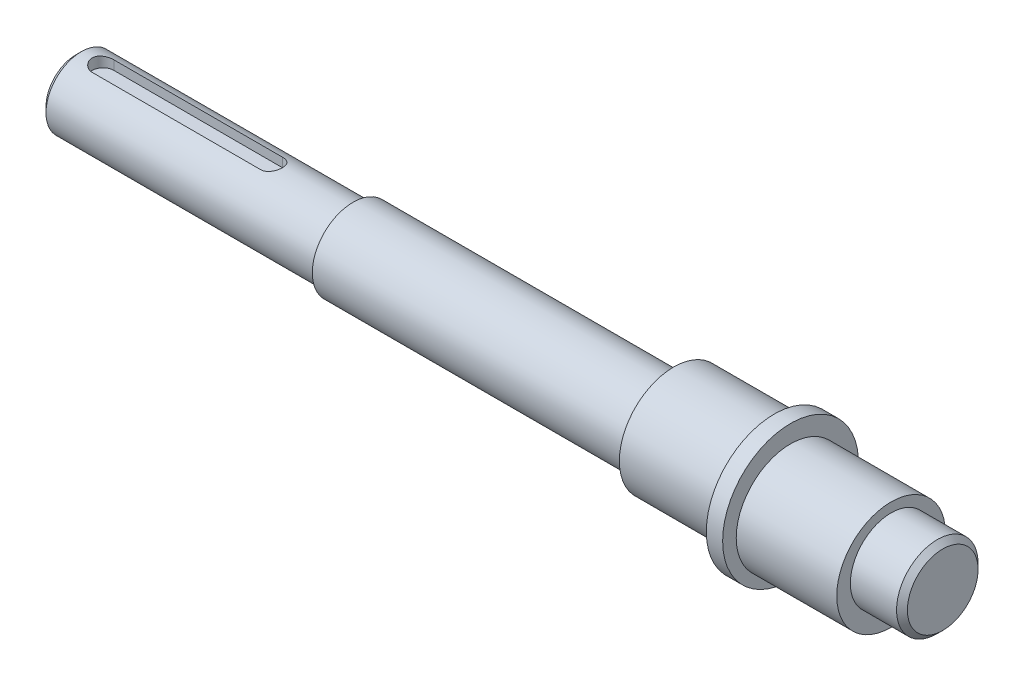
ISO-10303-21;
HEADER;
FILE_DESCRIPTION(('STEP AP214'),'2;1');
FILE_NAME('part.step','',(''),(''),'','','');
FILE_SCHEMA(('AUTOMOTIVE_DESIGN { 1 0 10303 214 1 1 1 1 }'));
ENDSEC;
DATA;
#1=APPLICATION_CONTEXT('core data for automotive mechanical design processes');
#2=APPLICATION_PROTOCOL_DEFINITION('international standard','automotive_design',2000,#1);
#3=PRODUCT_CONTEXT('',#1,'mechanical');
#4=PRODUCT('Part','Part','',(#3));
#5=PRODUCT_RELATED_PRODUCT_CATEGORY('part','',(#4));
#6=PRODUCT_DEFINITION_FORMATION('','',#4);
#7=PRODUCT_DEFINITION_CONTEXT('part definition',#1,'design');
#8=PRODUCT_DEFINITION('design','',#6,#7);
#9=PRODUCT_DEFINITION_SHAPE('','',#8);
#10=(LENGTH_UNIT() NAMED_UNIT(*) SI_UNIT(.MILLI.,.METRE.));
#11=(NAMED_UNIT(*) PLANE_ANGLE_UNIT() SI_UNIT($,.RADIAN.));
#12=(NAMED_UNIT(*) SI_UNIT($,.STERADIAN.) SOLID_ANGLE_UNIT());
#13=UNCERTAINTY_MEASURE_WITH_UNIT(LENGTH_MEASURE(1.E-05),#10,'distance_accuracy_value','');
#14=(GEOMETRIC_REPRESENTATION_CONTEXT(3) GLOBAL_UNCERTAINTY_ASSIGNED_CONTEXT((#13)) GLOBAL_UNIT_ASSIGNED_CONTEXT((#10,
#11,#12)) REPRESENTATION_CONTEXT('',''));
#15=CARTESIAN_POINT('',(0.,0.,0.));
#16=DIRECTION('',(0.,0.,1.));
#17=DIRECTION('',(1.,0.,0.));
#18=AXIS2_PLACEMENT_3D('',#15,#16,#17);
#19=CARTESIAN_POINT('',(0.,0.,0.));
#20=DIRECTION('',(-1.,0.,0.));
#21=DIRECTION('',(0.,0.,1.));
#22=AXIS2_PLACEMENT_3D('',#19,#20,#21);
#23=CYLINDRICAL_SURFACE('',#22,13.);
#24=CARTESIAN_POINT('',(102.,0.,0.));
#25=DIRECTION('',(-1.,0.,0.));
#26=DIRECTION('',(0.,0.,1.));
#27=AXIS2_PLACEMENT_3D('',#24,#25,#26);
#28=CIRCLE('',#27,13.);
#29=CARTESIAN_POINT('',(102.,0.,13.));
#30=VERTEX_POINT('',#29);
#31=EDGE_CURVE('E176',#30,#30,#28,.T.);
#32=ORIENTED_EDGE('',*,*,#31,.T.);
#33=EDGE_LOOP('',(#32));
#34=FACE_BOUND('',#33,.T.);
#35=DIRECTION('',(-1.,0.,0.));
#36=VECTOR('',#35,1.);
#37=CARTESIAN_POINT('',(0.,12.369316876853,-4.));
#38=LINE('',#37,#36);
#39=CARTESIAN_POINT('',(10.,12.369316876853,-4.));
#40=VERTEX_POINT('',#39);
#41=CARTESIAN_POINT('',(72.,12.369316876853,-4.));
#42=VERTEX_POINT('',#41);
#43=EDGE_CURVE('E70',#40,#42,#38,.F.);
#44=ORIENTED_EDGE('',*,*,#43,.T.);
#45=CARTESIAN_POINT('',(72.,12.369316876853,-4.));
#46=CARTESIAN_POINT('',(72.1096372600446,12.3693011060559,-4.00001385554605));
#47=CARTESIAN_POINT('',(72.2192655313805,12.3707741918502,-3.99549264927955));
#48=CARTESIAN_POINT('',(72.437682370079,12.3765808295348,-3.97748793948736));
#49=CARTESIAN_POINT('',(72.5464711284459,12.3809137101209,-3.96400653926006));
#50=CARTESIAN_POINT('',(72.7621561511989,12.3923078282768,-3.9282361528359));
#51=CARTESIAN_POINT('',(72.8690566313853,12.399361878995,-3.90597036349974));
#52=CARTESIAN_POINT('',(73.0804758893724,12.4159696129904,-3.85285190224663));
#53=CARTESIAN_POINT('',(73.1849945996163,12.4255233670738,-3.82199898709018));
#54=CARTESIAN_POINT('',(73.4938136119439,12.4575175837827,-3.71694513232446));
#55=CARTESIAN_POINT('',(73.6936609638533,12.483307156321,-3.63020142616738));
#56=CARTESIAN_POINT('',(74.0759730566924,12.5408839490093,-3.42599155981652));
#57=CARTESIAN_POINT('',(74.2584290710015,12.572674156561,-3.30851008560228));
#58=CARTESIAN_POINT('',(74.6068944704852,12.639849464286,-3.04197546692094));
#59=CARTESIAN_POINT('',(74.7722464055913,12.6753137902419,-2.892081048213));
#60=CARTESIAN_POINT('',(75.0759050606162,12.7451676286833,-2.56677638136855));
#61=CARTESIAN_POINT('',(75.214207160722,12.7795569567298,-2.391361783573));
#62=CARTESIAN_POINT('',(75.4627491497664,12.8442939900254,-2.01525564040856));
#63=CARTESIAN_POINT('',(75.5723094463478,12.8745369018167,-1.81409533176948));
#64=CARTESIAN_POINT('',(75.7557811144326,12.9266435229377,-1.39512400470614));
#65=CARTESIAN_POINT('',(75.8297020523437,12.9485094805068,-1.17731747270964));
#66=CARTESIAN_POINT('',(75.9376008367771,12.980836680659,-0.738159816541966));
#67=CARTESIAN_POINT('',(75.9727098340494,12.9916202110484,-0.517110769217928));
#68=CARTESIAN_POINT('',(76.0055692569542,13.0017046486491,-0.0720095541966275));
#69=CARTESIAN_POINT('',(76.0033271593172,13.0010078539271,0.152042003503076));
#70=CARTESIAN_POINT('',(75.9622968189137,12.9884354452262,0.588828322821336));
#71=CARTESIAN_POINT('',(75.9247349307784,12.976934963743,0.801690801267577));
#72=CARTESIAN_POINT('',(75.8161398522449,12.9445067865243,1.21792737916861));
#73=CARTESIAN_POINT('',(75.7451048789415,12.923578588635,1.42130097257467));
#74=CARTESIAN_POINT('',(75.5707776354454,12.8741371346781,1.81565284792357));
#75=CARTESIAN_POINT('',(75.467107683292,12.8455356806846,2.00645263453306));
#76=CARTESIAN_POINT('',(75.2307457129234,12.7837686435913,2.36833420473324));
#77=CARTESIAN_POINT('',(75.0980468640906,12.7506019869631,2.53941133301027));
#78=CARTESIAN_POINT('',(74.8011250886356,12.6816648743268,2.86427703670677));
#79=CARTESIAN_POINT('',(74.6358457956793,12.6458433558745,3.0170888572714));
#80=CARTESIAN_POINT('',(74.2815126504035,12.5767737605626,3.29318735472968));
#81=CARTESIAN_POINT('',(74.0924517537655,12.5435264509396,3.41646525186121));
#82=CARTESIAN_POINT('',(73.7938396017376,12.4983185398609,3.57703281324441));
#83=CARTESIAN_POINT('',(73.6911363005608,12.48395455757,3.62672040705996));
#84=CARTESIAN_POINT('',(73.4816454525383,12.4573073197885,3.7172196774293));
#85=CARTESIAN_POINT('',(73.3748596042099,12.4450232102831,3.75803499898249));
#86=CARTESIAN_POINT('',(73.1580745856221,12.4229432446499,3.83039332264369));
#87=CARTESIAN_POINT('',(73.0480789565303,12.413144753996,3.86194614776658));
#88=CARTESIAN_POINT('',(72.8256286652894,12.3963449677289,3.91553543389294));
#89=CARTESIAN_POINT('',(72.71317515978,12.3893423850732,3.93757627393456));
#90=CARTESIAN_POINT('',(72.5006880875263,12.3790500430556,3.96980876445186));
#91=CARTESIAN_POINT('',(72.4008413202086,12.3754078485105,3.98112989977237));
#92=CARTESIAN_POINT('',(72.2006656348951,12.3705374921442,3.9962248840057));
#93=CARTESIAN_POINT('',(72.1003376173718,12.3693058643752,4.00000956907256));
#94=CARTESIAN_POINT('',(72.,12.369316876853,4.));
#95=B_SPLINE_CURVE_WITH_KNOTS('',3,(#45,#46,#47,#48,#49,#50,#51,#52,#53,#54,#55,#56,#57,#58,#59,
#60,#61,#62,#63,#64,#65,#66,#67,#68,#69,#70,#71,#72,#73,#74,#75,#76,#77,#78,#79,#80,#81,#82,#83,
#84,#85,#86,#87,#88,#89,#90,#91,#92,#93,#94),.UNSPECIFIED.,.F.,.F.,(4,2,2,2,2,2,2,2,2,2,2,2,2,2,
2,2,2,2,2,2,2,2,2,2,4),(0.,0.328793421203149,0.65750968932791,0.985363667706867,
1.31322693384514,1.96809857989085,2.6232971162299,3.2981478003895,3.97311364113685,
4.66283549043959,5.35237209962388,6.02123451698755,6.68996304687303,7.33629750679724,
7.98266639687212,8.63680913532383,9.2911059621096,9.97181686260362,10.6527298725226,
10.9973477032526,11.3418236857872,11.6859330155993,12.0298837581651,12.3312338730857,
12.6321503832144),.UNSPECIFIED.);
#96=CARTESIAN_POINT('',(72.,12.369316876853,4.));
#97=VERTEX_POINT('',#96);
#98=EDGE_CURVE('E113',#42,#97,#95,.T.);
#99=ORIENTED_EDGE('',*,*,#98,.T.);
#100=DIRECTION('',(-1.,0.,0.));
#101=VECTOR('',#100,1.);
#102=CARTESIAN_POINT('',(0.,12.369316876853,4.));
#103=LINE('',#102,#101);
#104=CARTESIAN_POINT('',(10.,12.369316876853,4.));
#105=VERTEX_POINT('',#104);
#106=EDGE_CURVE('E127',#97,#105,#103,.T.);
#107=ORIENTED_EDGE('',*,*,#106,.T.);
#108=CARTESIAN_POINT('',(10.,12.369316876853,4.));
#109=CARTESIAN_POINT('',(9.89036273995537,12.3693011060559,4.00001385554605));
#110=CARTESIAN_POINT('',(9.78073446861947,12.3707741918502,3.99549264927955));
#111=CARTESIAN_POINT('',(9.56231762992102,12.3765808295348,3.97748793948736));
#112=CARTESIAN_POINT('',(9.45352887155407,12.3809137101209,3.96400653926006));
#113=CARTESIAN_POINT('',(9.23784384880108,12.3923078282768,3.9282361528359));
#114=CARTESIAN_POINT('',(9.13094336861471,12.399361878995,3.90597036349973));
#115=CARTESIAN_POINT('',(8.91952411062753,12.4159696129904,3.85285190224662));
#116=CARTESIAN_POINT('',(8.81500540038364,12.4255233670738,3.82199898709017));
#117=CARTESIAN_POINT('',(8.50618638805607,12.4575175837827,3.71694513232446));
#118=CARTESIAN_POINT('',(8.30633903614675,12.483307156321,3.63020142616738));
#119=CARTESIAN_POINT('',(7.92402694330763,12.5408839490093,3.42599155981652));
#120=CARTESIAN_POINT('',(7.74157092899853,12.572674156561,3.30851008560228));
#121=CARTESIAN_POINT('',(7.39310552951482,12.639849464286,3.04197546692094));
#122=CARTESIAN_POINT('',(7.22775359440872,12.6753137902419,2.89208104821299));
#123=CARTESIAN_POINT('',(6.92409493938383,12.7451676286833,2.56677638136855));
#124=CARTESIAN_POINT('',(6.78579283927796,12.7795569567298,2.39136178357301));
#125=CARTESIAN_POINT('',(6.5372508502336,12.8442939900254,2.01525564040857));
#126=CARTESIAN_POINT('',(6.42769055365221,12.8745369018167,1.81409533176949));
#127=CARTESIAN_POINT('',(6.24421888556742,12.9266435229377,1.39512400470615));
#128=CARTESIAN_POINT('',(6.17029794765629,12.9485094805067,1.17731747270964));
#129=CARTESIAN_POINT('',(6.06239916322291,12.9808366806589,0.738159816541973));
#130=CARTESIAN_POINT('',(6.02729016595059,12.9916202110484,0.517110769217936));
#131=CARTESIAN_POINT('',(5.99443074304575,13.0017046486491,0.0720095541966365));
#132=CARTESIAN_POINT('',(5.99667284068277,13.0010078539271,-0.152042003503067));
#133=CARTESIAN_POINT('',(6.0377031810863,12.9884354452262,-0.588828322821328));
#134=CARTESIAN_POINT('',(6.07526506922162,12.976934963743,-0.801690801267568));
#135=CARTESIAN_POINT('',(6.18386014775509,12.9445067865243,-1.2179273791686));
#136=CARTESIAN_POINT('',(6.25489512105847,12.923578588635,-1.42130097257467));
#137=CARTESIAN_POINT('',(6.42922236455455,12.8741371346781,-1.81565284792357));
#138=CARTESIAN_POINT('',(6.532892316708,12.8455356806846,-2.00645263453305));
#139=CARTESIAN_POINT('',(6.76925428707662,12.7837686435913,-2.36833420473324));
#140=CARTESIAN_POINT('',(6.90195313590943,12.7506019869631,-2.53941133301026));
#141=CARTESIAN_POINT('',(7.19887491136439,12.6816648743268,-2.86427703670677));
#142=CARTESIAN_POINT('',(7.36415420432072,12.6458433558745,-3.0170888572714));
#143=CARTESIAN_POINT('',(7.71848734959652,12.5767737605626,-3.29318735472968));
#144=CARTESIAN_POINT('',(7.90754824623452,12.5435264509396,-3.41646525186121));
#145=CARTESIAN_POINT('',(8.20616039826237,12.4983185398609,-3.57703281324441));
#146=CARTESIAN_POINT('',(8.30886369943916,12.48395455757,-3.62672040705995));
#147=CARTESIAN_POINT('',(8.51835454746166,12.4573073197885,-3.7172196774293));
#148=CARTESIAN_POINT('',(8.62514039579012,12.4450232102831,-3.75803499898249));
#149=CARTESIAN_POINT('',(8.84192541437791,12.4229432446499,-3.83039332264369));
#150=CARTESIAN_POINT('',(8.95192104346967,12.413144753996,-3.86194614776658));
#151=CARTESIAN_POINT('',(9.17437133471058,12.3963449677289,-3.91553543389294));
#152=CARTESIAN_POINT('',(9.28682484021998,12.3893423850733,-3.93757627393455));
#153=CARTESIAN_POINT('',(9.4993119124737,12.3790500430556,-3.96980876445186));
#154=CARTESIAN_POINT('',(9.59915867979138,12.3754078485105,-3.98112989977237));
#155=CARTESIAN_POINT('',(9.7993343651049,12.3705374921442,-3.9962248840057));
#156=CARTESIAN_POINT('',(9.89966238262821,12.3693058643752,-4.00000956907256));
#157=CARTESIAN_POINT('',(10.,12.369316876853,-4.));
#158=B_SPLINE_CURVE_WITH_KNOTS('',3,(#108,#109,#110,#111,#112,#113,#114,#115,#116,#117,#118,
#119,#120,#121,#122,#123,#124,#125,#126,#127,#128,#129,#130,#131,#132,#133,#134,#135,#136,#137,
#138,#139,#140,#141,#142,#143,#144,#145,#146,#147,#148,#149,#150,#151,#152,#153,#154,#155,#156,
#157),.UNSPECIFIED.,.F.,.F.,(4,2,2,2,2,2,2,2,2,2,2,2,2,2,2,2,2,2,2,2,2,2,2,2,4),(0.,
0.328793421203159,0.657509689327917,0.985363667706894,1.31322693384514,1.96809857989084,
2.62329711622991,3.2981478003895,3.97311364113684,4.66283549043959,5.35237209962388,
6.02123451698754,6.68996304687302,7.33629750679723,7.98266639687211,8.63680913532382,
9.29110596210959,9.97181686260362,10.6527298725226,10.9973477032526,11.3418236857872,
11.6859330155993,12.0298837581651,12.3312338730857,12.6321503832144),.UNSPECIFIED.);
#159=EDGE_CURVE('E62',#105,#40,#158,.T.);
#160=ORIENTED_EDGE('',*,*,#159,.T.);
#161=EDGE_LOOP('',(#44,#99,#107,#160));
#162=FACE_BOUND('',#161,.T.);
#163=CARTESIAN_POINT('',(2.00000000000001,0.,0.));
#164=DIRECTION('',(1.,0.,0.));
#165=DIRECTION('',(0.,0.,-1.));
#166=AXIS2_PLACEMENT_3D('',#163,#164,#165);
#167=CIRCLE('',#166,13.);
#168=CARTESIAN_POINT('',(2.00000000000001,0.,-13.));
#169=VERTEX_POINT('',#168);
#170=EDGE_CURVE('E225',#169,#169,#167,.T.);
#171=ORIENTED_EDGE('',*,*,#170,.T.);
#172=EDGE_LOOP('',(#171));
#173=FACE_BOUND('',#172,.T.);
#174=CARTESIAN_POINT('',(66.9173344945528,-12.6835606052715,-2.85084029233573));
#175=CARTESIAN_POINT('',(67.1157213952259,-12.6552913916044,-2.97662670948751));
#176=CARTESIAN_POINT('',(67.3253783806156,-12.6288982722451,-3.08539767422088));
#177=CARTESIAN_POINT('',(67.7605506543675,-12.5830707684621,-3.26728815263414));
#178=CARTESIAN_POINT('',(67.9860909164697,-12.5636476492071,-3.34035002033104));
#179=CARTESIAN_POINT('',(68.4473360877684,-12.5340342309266,-3.44981672616192));
#180=CARTESIAN_POINT('',(68.6830737396497,-12.5238764075633,-3.48609267572668));
#181=CARTESIAN_POINT('',(69.1574274800679,-12.5141243818434,-3.52094068154293));
#182=CARTESIAN_POINT('',(69.3960424389025,-12.5145261603711,-3.51952708290181));
#183=CARTESIAN_POINT('',(69.875470947315,-12.5259726132645,-3.4785742083382));
#184=CARTESIAN_POINT('',(70.1162016859176,-12.5372703335671,-3.43812844017442));
#185=CARTESIAN_POINT('',(70.5872329687111,-12.5694848384384,-3.31841245117753));
#186=CARTESIAN_POINT('',(70.8175303296424,-12.590404537282,-3.2391304672791));
#187=CARTESIAN_POINT('',(71.2596318460295,-12.6391377942759,-3.04340041590033));
#188=CARTESIAN_POINT('',(71.4715226798384,-12.6669163734039,-2.92714008998995));
#189=CARTESIAN_POINT('',(71.8710065258989,-12.7259187862294,-2.65890704484376));
#190=CARTESIAN_POINT('',(72.0586000568432,-12.7571425463538,-2.50693508816587));
#191=CARTESIAN_POINT('',(72.3923080058158,-12.817133228402,-2.17884210006733));
#192=CARTESIAN_POINT('',(72.5401069155112,-12.845942125574,-2.00445237108882));
#193=CARTESIAN_POINT('',(72.799088523332,-12.8988271246437,-1.62967157831974));
#194=CARTESIAN_POINT('',(72.910320674079,-12.9229096005968,-1.42931614621692));
#195=CARTESIAN_POINT('',(73.0767055447635,-12.9598544110828,-1.03712245044674));
#196=CARTESIAN_POINT('',(73.1373677091013,-12.9737863832827,-0.847726891800303));
#197=CARTESIAN_POINT('',(73.221561148623,-12.993281173824,-0.460479090835774));
#198=CARTESIAN_POINT('',(73.2451322505388,-12.9988529686523,-0.262636153802116));
#199=CARTESIAN_POINT('',(73.2529692259831,-13.0007001256065,0.108165730053142));
#200=CARTESIAN_POINT('',(73.241919946633,-12.998083596739,0.281037107815758));
#201=CARTESIAN_POINT('',(73.191124610368,-12.9862208627676,0.622246768923069));
#202=CARTESIAN_POINT('',(73.1513809177182,-12.9769752038687,0.790585424554371));
#203=CARTESIAN_POINT('',(73.0462294406367,-12.9530750516817,1.11532635839424));
#204=CARTESIAN_POINT('',(72.9812749559734,-12.9385163509229,1.27188416817763));
#205=CARTESIAN_POINT('',(72.8285604864168,-12.9053800837984,1.57293869007208));
#206=CARTESIAN_POINT('',(72.7407942762888,-12.8868014206321,1.71743209560869));
#207=CARTESIAN_POINT('',(72.536470720653,-12.8453719185997,2.00485573146585));
#208=CARTESIAN_POINT('',(72.4179905131795,-12.8222841691974,2.14638083702675));
#209=CARTESIAN_POINT('',(72.161506283146,-12.7753102543076,2.41028019565786));
#210=CARTESIAN_POINT('',(72.0234922806739,-12.7514236854932,2.53264459169497));
#211=CARTESIAN_POINT('',(71.7116591892001,-12.7016375759763,2.77225163127206));
#212=CARTESIAN_POINT('',(71.5355240493874,-12.6759079184577,2.88651870781126));
#213=CARTESIAN_POINT('',(71.1676342061548,-12.6284862637664,3.08739417114627));
#214=CARTESIAN_POINT('',(70.9758722697889,-12.6067961517541,3.17398965769151));
#215=CARTESIAN_POINT('',(70.5604336753438,-12.5675469810236,3.32620428781362));
#216=CARTESIAN_POINT('',(70.3355238129305,-12.5506645940509,3.38864917036018));
#217=CARTESIAN_POINT('',(69.8782207138271,-12.5262897247362,3.47767168846793));
#218=CARTESIAN_POINT('',(69.6458259887777,-12.5187991219156,3.50424214477679));
#219=CARTESIAN_POINT('',(69.1702497399692,-12.5139770254183,3.52143369836946));
#220=CARTESIAN_POINT('',(68.9270087706744,-12.5170641494682,3.51057335867875));
#221=CARTESIAN_POINT('',(68.4458112568562,-12.5339566074032,3.44976851738166));
#222=CARTESIAN_POINT('',(68.2078554844298,-12.5477634968471,3.3998183433914));
#223=CARTESIAN_POINT('',(67.7432961698748,-12.5844500383419,3.26140096871732));
#224=CARTESIAN_POINT('',(67.5167311215536,-12.6073583933653,3.17281182638315));
#225=CARTESIAN_POINT('',(67.0826269225019,-12.6594023113411,2.95832212055732));
#226=CARTESIAN_POINT('',(66.8750915325462,-12.6885391014268,2.83241420258684));
#227=CARTESIAN_POINT('',(66.4920294286561,-12.7484074162907,2.54919999933605));
#228=CARTESIAN_POINT('',(66.3157600576138,-12.7790699890963,2.3928888885814));
#229=CARTESIAN_POINT('',(65.9959104122984,-12.8386227276397,2.04938756864715));
#230=CARTESIAN_POINT('',(65.8523030832367,-12.8675143457044,1.8622231393537));
#231=CARTESIAN_POINT('',(65.6192638171656,-12.9163875925768,1.48305272742568));
#232=CARTESIAN_POINT('',(65.5256914095051,-12.9369903950704,1.29368451890605));
#233=CARTESIAN_POINT('',(65.3772980464777,-12.9703241385579,0.899727056803342));
#234=CARTESIAN_POINT('',(65.3224203396953,-12.9830666044307,0.695160582843896));
#235=CARTESIAN_POINT('',(65.2603932546736,-12.9975371198872,0.30939318939838));
#236=CARTESIAN_POINT('',(65.2474259968566,-13.0006060996969,0.12916369584239));
#237=CARTESIAN_POINT('',(65.2534167269883,-12.999195621822,-0.230704261775413));
#238=CARTESIAN_POINT('',(65.2723627031422,-12.9947190042179,-0.41034292272312));
#239=CARTESIAN_POINT('',(65.3387109560351,-12.9793074493634,-0.75158371504155));
#240=CARTESIAN_POINT('',(65.3841563050901,-12.9688174150026,-0.913594430270775));
#241=CARTESIAN_POINT('',(65.4996216064334,-12.9428182083359,-1.22816637356345));
#242=CARTESIAN_POINT('',(65.5696494478963,-12.9273074248629,-1.38072454954225));
#243=CARTESIAN_POINT('',(65.7361100366328,-12.8916859827619,-1.68189800851314));
#244=CARTESIAN_POINT('',(65.8338453794568,-12.871359686247,-1.82976345393253));
#245=CARTESIAN_POINT('',(66.0499315645377,-12.8285565938856,-2.10905657175011));
#246=CARTESIAN_POINT('',(66.168276239073,-12.8060804423273,-2.24048914182932));
#247=CARTESIAN_POINT('',(66.3901423931721,-12.7665089063241,-2.45457705380332));
#248=CARTESIAN_POINT('',(66.4899098604623,-12.7494814594871,-2.54118782753894));
#249=CARTESIAN_POINT('',(66.6977071842756,-12.7159582959305,-2.7039411585813));
#250=CARTESIAN_POINT('',(66.8057377452097,-12.6994626247145,-2.78008282186753));
#251=CARTESIAN_POINT('',(66.9173344945528,-12.6835606052715,-2.85084029233573));
#252=B_SPLINE_CURVE_WITH_KNOTS('',3,(#174,#175,#176,#177,#178,#179,#180,#181,#182,#183,#184,
#185,#186,#187,#188,#189,#190,#191,#192,#193,#194,#195,#196,#197,#198,#199,#200,#201,#202,#203,
#204,#205,#206,#207,#208,#209,#210,#211,#212,#213,#214,#215,#216,#217,#218,#219,#220,#221,#222,
#223,#224,#225,#226,#227,#228,#229,#230,#231,#232,#233,#234,#235,#236,#237,#238,#239,#240,#241,
#242,#243,#244,#245,#246,#247,#248,#249,#250,#251),.UNSPECIFIED.,.T.,.F.,(4,2,2,2,2,2,2,2,2,2,2,
2,2,2,2,2,2,2,2,2,2,2,2,2,2,2,2,2,2,2,2,2,2,2,2,2,2,2,4),(0.,0.709305051742608,1.4197513990184,
2.13267845865677,2.84533417332894,3.57494925594784,4.30478546777589,5.03097386169815,
5.75714675057674,6.44439133760517,7.13070263942843,7.725254747039,8.31916801437064,
8.83634633695263,9.35348205168941,9.86172074377517,10.3700982781923,10.925933829218,
11.4820543913968,12.1140352183083,12.7463102407153,13.4452488285995,14.1443272685632,
14.8713862862184,15.5985508280548,16.3280270415985,17.0576471100359,17.7665098509484,
18.4747832671118,19.1076369252013,19.7395604696476,20.2788377478881,20.8179120933697,
21.3214722599676,21.8251941803594,22.3583164161201,22.8912793785628,23.2902441436128,
23.6892429575394),.UNSPECIFIED.);
#253=CARTESIAN_POINT('',(66.9173344945528,-12.6835606052715,-2.85084029233573));
#254=VERTEX_POINT('',#253);
#255=EDGE_CURVE('E11',#254,#254,#252,.T.);
#256=ORIENTED_EDGE('',*,*,#255,.F.);
#257=EDGE_LOOP('',(#256));
#258=FACE_BOUND('',#257,.T.);
#259=ADVANCED_FACE('F41',(#34,#162,#173,#258),#23,.T.);
#260=CARTESIAN_POINT('',(0.,0.,0.));
#261=DIRECTION('',(1.,0.,0.));
#262=DIRECTION('',(0.,0.,-1.));
#263=AXIS2_PLACEMENT_3D('',#260,#261,#262);
#264=PLANE('',#263);
#265=CARTESIAN_POINT('',(0.,0.,0.));
#266=DIRECTION('',(1.,0.,0.));
#267=DIRECTION('',(0.,0.,-1.));
#268=AXIS2_PLACEMENT_3D('',#265,#266,#267);
#269=CIRCLE('',#268,11.);
#270=CARTESIAN_POINT('',(0.,0.,-11.));
#271=VERTEX_POINT('',#270);
#272=EDGE_CURVE('E222',#271,#271,#269,.F.);
#273=ORIENTED_EDGE('',*,*,#272,.T.);
#274=EDGE_LOOP('',(#273));
#275=FACE_BOUND('',#274,.T.);
#276=ADVANCED_FACE('F96',(#275),#264,.F.);
#277=CARTESIAN_POINT('',(102.,13.,0.));
#278=DIRECTION('',(1.,0.,0.));
#279=DIRECTION('',(0.,0.,-1.));
#280=AXIS2_PLACEMENT_3D('',#277,#278,#279);
#281=PLANE('',#280);
#282=ORIENTED_EDGE('',*,*,#31,.F.);
#283=EDGE_LOOP('',(#282));
#284=FACE_BOUND('',#283,.T.);
#285=CARTESIAN_POINT('',(102.,0.,0.));
#286=DIRECTION('',(-1.,0.,0.));
#287=DIRECTION('',(0.,0.,1.));
#288=AXIS2_PLACEMENT_3D('',#285,#286,#287);
#289=CIRCLE('',#288,15.);
#290=CARTESIAN_POINT('',(102.,0.,15.));
#291=VERTEX_POINT('',#290);
#292=EDGE_CURVE('E174',#291,#291,#289,.T.);
#293=ORIENTED_EDGE('',*,*,#292,.T.);
#294=EDGE_LOOP('',(#293));
#295=FACE_BOUND('',#294,.T.);
#296=ADVANCED_FACE('F102',(#284,#295),#281,.F.);
#297=CARTESIAN_POINT('',(0.,0.,0.));
#298=DIRECTION('',(-1.,0.,0.));
#299=DIRECTION('',(0.,0.,1.));
#300=AXIS2_PLACEMENT_3D('',#297,#298,#299);
#301=CYLINDRICAL_SURFACE('',#300,15.);
#302=CARTESIAN_POINT('',(220.,0.,0.));
#303=DIRECTION('',(-1.,0.,0.));
#304=DIRECTION('',(0.,0.,1.));
#305=AXIS2_PLACEMENT_3D('',#302,#303,#304);
#306=CIRCLE('',#305,15.);
#307=CARTESIAN_POINT('',(220.,0.,15.));
#308=VERTEX_POINT('',#307);
#309=EDGE_CURVE('E171',#308,#308,#306,.T.);
#310=ORIENTED_EDGE('',*,*,#309,.T.);
#311=EDGE_LOOP('',(#310));
#312=FACE_BOUND('',#311,.T.);
#313=ORIENTED_EDGE('',*,*,#292,.F.);
#314=EDGE_LOOP('',(#313));
#315=FACE_BOUND('',#314,.T.);
#316=ADVANCED_FACE('F135',(#312,#315),#301,.T.);
#317=CARTESIAN_POINT('',(10.,9.,0.));
#318=DIRECTION('',(0.,1.,0.));
#319=DIRECTION('',(0.,0.,1.));
#320=AXIS2_PLACEMENT_3D('',#317,#318,#319);
#321=CYLINDRICAL_SURFACE('',#320,4.);
#322=DIRECTION('',(0.,1.,0.));
#323=VECTOR('',#322,1.);
#324=CARTESIAN_POINT('',(10.,9.,4.));
#325=LINE('',#324,#323);
#326=CARTESIAN_POINT('',(10.,9.,4.));
#327=VERTEX_POINT('',#326);
#328=EDGE_CURVE('E186',#327,#105,#325,.T.);
#329=ORIENTED_EDGE('',*,*,#328,.F.);
#330=CARTESIAN_POINT('',(10.,9.,0.));
#331=DIRECTION('',(0.,1.,0.));
#332=DIRECTION('',(0.,0.,1.));
#333=AXIS2_PLACEMENT_3D('',#330,#331,#332);
#334=CIRCLE('',#333,4.);
#335=CARTESIAN_POINT('',(10.,9.,-4.));
#336=VERTEX_POINT('',#335);
#337=EDGE_CURVE('E203',#336,#327,#334,.T.);
#338=ORIENTED_EDGE('',*,*,#337,.F.);
#339=DIRECTION('',(0.,1.,0.));
#340=VECTOR('',#339,1.);
#341=CARTESIAN_POINT('',(10.,9.,-4.));
#342=LINE('',#341,#340);
#343=EDGE_CURVE('E185',#336,#40,#342,.T.);
#344=ORIENTED_EDGE('',*,*,#343,.T.);
#345=ORIENTED_EDGE('',*,*,#159,.F.);
#346=EDGE_LOOP('',(#329,#338,#344,#345));
#347=FACE_BOUND('',#346,.T.);
#348=ADVANCED_FACE('F129',(#347),#321,.F.);
#349=CARTESIAN_POINT('',(10.,9.,-4.));
#350=DIRECTION('',(0.,0.,-1.));
#351=DIRECTION('',(-1.,0.,0.));
#352=AXIS2_PLACEMENT_3D('',#349,#350,#351);
#353=PLANE('',#352);
#354=ORIENTED_EDGE('',*,*,#343,.F.);
#355=DIRECTION('',(-1.,0.,0.));
#356=VECTOR('',#355,1.);
#357=CARTESIAN_POINT('',(10.,9.,-4.));
#358=LINE('',#357,#356);
#359=CARTESIAN_POINT('',(72.,9.,-4.));
#360=VERTEX_POINT('',#359);
#361=EDGE_CURVE('E189',#360,#336,#358,.T.);
#362=ORIENTED_EDGE('',*,*,#361,.F.);
#363=DIRECTION('',(0.,1.,0.));
#364=VECTOR('',#363,1.);
#365=CARTESIAN_POINT('',(72.,9.,-4.));
#366=LINE('',#365,#364);
#367=EDGE_CURVE('E192',#360,#42,#366,.T.);
#368=ORIENTED_EDGE('',*,*,#367,.T.);
#369=ORIENTED_EDGE('',*,*,#43,.F.);
#370=EDGE_LOOP('',(#354,#362,#368,#369));
#371=FACE_BOUND('',#370,.T.);
#372=ADVANCED_FACE('F134',(#371),#353,.F.);
#373=CARTESIAN_POINT('',(72.,9.,0.));
#374=DIRECTION('',(0.,1.,0.));
#375=DIRECTION('',(0.,0.,1.));
#376=AXIS2_PLACEMENT_3D('',#373,#374,#375);
#377=CYLINDRICAL_SURFACE('',#376,4.);
#378=ORIENTED_EDGE('',*,*,#367,.F.);
#379=CARTESIAN_POINT('',(72.,9.,0.));
#380=DIRECTION('',(0.,1.,0.));
#381=DIRECTION('',(0.,0.,1.));
#382=AXIS2_PLACEMENT_3D('',#379,#380,#381);
#383=CIRCLE('',#382,4.);
#384=CARTESIAN_POINT('',(72.,9.,4.));
#385=VERTEX_POINT('',#384);
#386=EDGE_CURVE('E197',#385,#360,#383,.T.);
#387=ORIENTED_EDGE('',*,*,#386,.F.);
#388=DIRECTION('',(0.,1.,0.));
#389=VECTOR('',#388,1.);
#390=CARTESIAN_POINT('',(72.,9.,4.));
#391=LINE('',#390,#389);
#392=EDGE_CURVE('E188',#385,#97,#391,.T.);
#393=ORIENTED_EDGE('',*,*,#392,.T.);
#394=ORIENTED_EDGE('',*,*,#98,.F.);
#395=EDGE_LOOP('',(#378,#387,#393,#394));
#396=FACE_BOUND('',#395,.T.);
#397=ADVANCED_FACE('F329',(#396),#377,.F.);
#398=CARTESIAN_POINT('',(10.,9.,4.));
#399=DIRECTION('',(0.,0.,1.));
#400=DIRECTION('',(1.,0.,0.));
#401=AXIS2_PLACEMENT_3D('',#398,#399,#400);
#402=PLANE('',#401);
#403=ORIENTED_EDGE('',*,*,#392,.F.);
#404=DIRECTION('',(1.,0.,0.));
#405=VECTOR('',#404,1.);
#406=CARTESIAN_POINT('',(10.,9.,4.));
#407=LINE('',#406,#405);
#408=EDGE_CURVE('E200',#327,#385,#407,.T.);
#409=ORIENTED_EDGE('',*,*,#408,.F.);
#410=ORIENTED_EDGE('',*,*,#328,.T.);
#411=ORIENTED_EDGE('',*,*,#106,.F.);
#412=EDGE_LOOP('',(#403,#409,#410,#411));
#413=FACE_BOUND('',#412,.T.);
#414=ADVANCED_FACE('F136',(#413),#402,.F.);
#415=CARTESIAN_POINT('',(10.,9.,0.));
#416=DIRECTION('',(0.,1.,0.));
#417=DIRECTION('',(0.,0.,1.));
#418=AXIS2_PLACEMENT_3D('',#415,#416,#417);
#419=PLANE('',#418);
#420=ORIENTED_EDGE('',*,*,#337,.T.);
#421=ORIENTED_EDGE('',*,*,#408,.T.);
#422=ORIENTED_EDGE('',*,*,#386,.T.);
#423=ORIENTED_EDGE('',*,*,#361,.T.);
#424=EDGE_LOOP('',(#420,#421,#422,#423));
#425=FACE_BOUND('',#424,.T.);
#426=ADVANCED_FACE('F308',(#425),#419,.T.);
#427=CARTESIAN_POINT('',(220.,1.5,0.));
#428=DIRECTION('',(1.,0.,0.));
#429=DIRECTION('',(0.,0.,-1.));
#430=AXIS2_PLACEMENT_3D('',#427,#428,#429);
#431=CYLINDRICAL_SURFACE('',#430,20.);
#432=CARTESIAN_POINT('',(220.,1.5,0.));
#433=DIRECTION('',(-1.,0.,0.));
#434=DIRECTION('',(0.,0.,1.));
#435=AXIS2_PLACEMENT_3D('',#432,#433,#434);
#436=CIRCLE('',#435,20.);
#437=CARTESIAN_POINT('',(220.,1.5,20.));
#438=VERTEX_POINT('',#437);
#439=EDGE_CURVE('E206',#438,#438,#436,.T.);
#440=ORIENTED_EDGE('',*,*,#439,.F.);
#441=EDGE_LOOP('',(#440));
#442=FACE_BOUND('',#441,.T.);
#443=CARTESIAN_POINT('',(257.,1.5,0.));
#444=DIRECTION('',(1.,0.,0.));
#445=DIRECTION('',(0.,0.,-1.));
#446=AXIS2_PLACEMENT_3D('',#443,#444,#445);
#447=CIRCLE('',#446,20.);
#448=CARTESIAN_POINT('',(257.,1.5,-20.));
#449=VERTEX_POINT('',#448);
#450=EDGE_CURVE('E386',#449,#449,#447,.F.);
#451=ORIENTED_EDGE('',*,*,#450,.T.);
#452=EDGE_LOOP('',(#451));
#453=FACE_BOUND('',#452,.T.);
#454=ADVANCED_FACE('F300',(#442,#453),#431,.T.);
#455=CARTESIAN_POINT('',(220.,1.5,0.));
#456=DIRECTION('',(-1.,0.,0.));
#457=DIRECTION('',(0.,0.,1.));
#458=AXIS2_PLACEMENT_3D('',#455,#456,#457);
#459=PLANE('',#458);
#460=ORIENTED_EDGE('',*,*,#309,.F.);
#461=EDGE_LOOP('',(#460));
#462=FACE_BOUND('',#461,.T.);
#463=ORIENTED_EDGE('',*,*,#439,.T.);
#464=EDGE_LOOP('',(#463));
#465=FACE_BOUND('',#464,.T.);
#466=ADVANCED_FACE('F151',(#462,#465),#459,.T.);
#467=CARTESIAN_POINT('',(263.,25.,0.));
#468=DIRECTION('',(-1.,0.,0.));
#469=DIRECTION('',(0.,0.,1.));
#470=AXIS2_PLACEMENT_3D('',#467,#468,#469);
#471=PLANE('',#470);
#472=CARTESIAN_POINT('',(263.,-1.5,0.));
#473=DIRECTION('',(-1.,0.,0.));
#474=DIRECTION('',(0.,0.,1.));
#475=AXIS2_PLACEMENT_3D('',#472,#473,#474);
#476=CIRCLE('',#475,20.);
#477=CARTESIAN_POINT('',(263.,-1.5,20.));
#478=VERTEX_POINT('',#477);
#479=EDGE_CURVE('E220',#478,#478,#476,.F.);
#480=ORIENTED_EDGE('',*,*,#479,.F.);
#481=EDGE_LOOP('',(#480));
#482=FACE_BOUND('',#481,.T.);
#483=CARTESIAN_POINT('',(263.,0.,0.));
#484=DIRECTION('',(-1.,0.,0.));
#485=DIRECTION('',(0.,0.,1.));
#486=AXIS2_PLACEMENT_3D('',#483,#484,#485);
#487=CIRCLE('',#486,25.);
#488=CARTESIAN_POINT('',(263.,0.,25.));
#489=VERTEX_POINT('',#488);
#490=EDGE_CURVE('E180',#489,#489,#487,.T.);
#491=ORIENTED_EDGE('',*,*,#490,.F.);
#492=EDGE_LOOP('',(#491));
#493=FACE_BOUND('',#492,.T.);
#494=ADVANCED_FACE('F147',(#482,#493),#471,.F.);
#495=CARTESIAN_POINT('',(0.,0.,0.));
#496=DIRECTION('',(-1.,0.,0.));
#497=DIRECTION('',(0.,0.,1.));
#498=AXIS2_PLACEMENT_3D('',#495,#496,#497);
#499=CYLINDRICAL_SURFACE('',#498,25.);
#500=CARTESIAN_POINT('',(257.,0.,0.));
#501=DIRECTION('',(-1.,0.,0.));
#502=DIRECTION('',(0.,0.,1.));
#503=AXIS2_PLACEMENT_3D('',#500,#501,#502);
#504=CIRCLE('',#503,25.);
#505=CARTESIAN_POINT('',(257.,0.,25.));
#506=VERTEX_POINT('',#505);
#507=EDGE_CURVE('E177',#506,#506,#504,.T.);
#508=ORIENTED_EDGE('',*,*,#507,.F.);
#509=EDGE_LOOP('',(#508));
#510=FACE_BOUND('',#509,.T.);
#511=ORIENTED_EDGE('',*,*,#490,.T.);
#512=EDGE_LOOP('',(#511));
#513=FACE_BOUND('',#512,.T.);
#514=ADVANCED_FACE('F150',(#510,#513),#499,.T.);
#515=CARTESIAN_POINT('',(257.,15.,0.));
#516=DIRECTION('',(1.,0.,0.));
#517=DIRECTION('',(0.,0.,-1.));
#518=AXIS2_PLACEMENT_3D('',#515,#516,#517);
#519=PLANE('',#518);
#520=ORIENTED_EDGE('',*,*,#450,.F.);
#521=EDGE_LOOP('',(#520));
#522=FACE_BOUND('',#521,.T.);
#523=ORIENTED_EDGE('',*,*,#507,.T.);
#524=EDGE_LOOP('',(#523));
#525=FACE_BOUND('',#524,.T.);
#526=ADVANCED_FACE('F155',(#522,#525),#519,.F.);
#527=CARTESIAN_POINT('',(300.,-1.5,0.));
#528=DIRECTION('',(-1.,0.,0.));
#529=DIRECTION('',(0.,0.,1.));
#530=AXIS2_PLACEMENT_3D('',#527,#528,#529);
#531=CYLINDRICAL_SURFACE('',#530,20.);
#532=CARTESIAN_POINT('',(300.,-1.5,0.));
#533=DIRECTION('',(1.,0.,0.));
#534=DIRECTION('',(0.,0.,-1.));
#535=AXIS2_PLACEMENT_3D('',#532,#533,#534);
#536=CIRCLE('',#535,20.);
#537=CARTESIAN_POINT('',(300.,-1.5,-20.));
#538=VERTEX_POINT('',#537);
#539=EDGE_CURVE('E210',#538,#538,#536,.T.);
#540=ORIENTED_EDGE('',*,*,#539,.F.);
#541=EDGE_LOOP('',(#540));
#542=FACE_BOUND('',#541,.T.);
#543=ORIENTED_EDGE('',*,*,#479,.T.);
#544=EDGE_LOOP('',(#543));
#545=FACE_BOUND('',#544,.T.);
#546=ADVANCED_FACE('F158',(#542,#545),#531,.T.);
#547=CARTESIAN_POINT('',(300.,-1.5,0.));
#548=DIRECTION('',(1.,0.,0.));
#549=DIRECTION('',(0.,0.,-1.));
#550=AXIS2_PLACEMENT_3D('',#547,#548,#549);
#551=PLANE('',#550);
#552=CARTESIAN_POINT('',(300.,0.,0.));
#553=DIRECTION('',(1.,0.,0.));
#554=DIRECTION('',(0.,0.,-1.));
#555=AXIS2_PLACEMENT_3D('',#552,#553,#554);
#556=CIRCLE('',#555,15.);
#557=CARTESIAN_POINT('',(300.,0.,-15.));
#558=VERTEX_POINT('',#557);
#559=EDGE_CURVE('E209',#558,#558,#556,.T.);
#560=ORIENTED_EDGE('',*,*,#559,.F.);
#561=EDGE_LOOP('',(#560));
#562=FACE_BOUND('',#561,.T.);
#563=ORIENTED_EDGE('',*,*,#539,.T.);
#564=EDGE_LOOP('',(#563));
#565=FACE_BOUND('',#564,.T.);
#566=ADVANCED_FACE('F141',(#562,#565),#551,.T.);
#567=CARTESIAN_POINT('',(319.,15.,0.));
#568=DIRECTION('',(-1.,0.,0.));
#569=DIRECTION('',(0.,0.,1.));
#570=AXIS2_PLACEMENT_3D('',#567,#568,#569);
#571=PLANE('',#570);
#572=CARTESIAN_POINT('',(319.,0.,0.));
#573=DIRECTION('',(-1.,0.,0.));
#574=DIRECTION('',(0.,0.,1.));
#575=AXIS2_PLACEMENT_3D('',#572,#573,#574);
#576=CIRCLE('',#575,13.0000000000001);
#577=CARTESIAN_POINT('',(319.,0.,13.0000000000001));
#578=VERTEX_POINT('',#577);
#579=EDGE_CURVE('E55',#578,#578,#576,.F.);
#580=ORIENTED_EDGE('',*,*,#579,.T.);
#581=EDGE_LOOP('',(#580));
#582=FACE_BOUND('',#581,.T.);
#583=ADVANCED_FACE('F137',(#582),#571,.F.);
#584=CARTESIAN_POINT('',(0.,0.,0.));
#585=DIRECTION('',(-1.,0.,0.));
#586=DIRECTION('',(0.,0.,1.));
#587=AXIS2_PLACEMENT_3D('',#584,#585,#586);
#588=CYLINDRICAL_SURFACE('',#587,15.);
#589=CARTESIAN_POINT('',(317.,0.,0.));
#590=DIRECTION('',(-1.,0.,0.));
#591=DIRECTION('',(0.,0.,1.));
#592=AXIS2_PLACEMENT_3D('',#589,#590,#591);
#593=CIRCLE('',#592,15.);
#594=CARTESIAN_POINT('',(317.,0.,15.));
#595=VERTEX_POINT('',#594);
#596=EDGE_CURVE('E228',#595,#595,#593,.T.);
#597=ORIENTED_EDGE('',*,*,#596,.T.);
#598=EDGE_LOOP('',(#597));
#599=FACE_BOUND('',#598,.T.);
#600=ORIENTED_EDGE('',*,*,#559,.T.);
#601=EDGE_LOOP('',(#600));
#602=FACE_BOUND('',#601,.T.);
#603=ADVANCED_FACE('F140',(#599,#602),#588,.T.);
#604=CARTESIAN_POINT('',(0.,0.,0.));
#605=DIRECTION('',(1.,0.,0.));
#606=DIRECTION('',(0.,0.,-1.));
#607=AXIS2_PLACEMENT_3D('',#604,#605,#606);
#608=CONICAL_SURFACE('',#607,11.,0.785398163397444);
#609=ORIENTED_EDGE('',*,*,#170,.F.);
#610=EDGE_LOOP('',(#609));
#611=FACE_BOUND('',#610,.T.);
#612=ORIENTED_EDGE('',*,*,#272,.F.);
#613=EDGE_LOOP('',(#612));
#614=FACE_BOUND('',#613,.T.);
#615=ADVANCED_FACE('F145',(#611,#614),#608,.T.);
#616=CARTESIAN_POINT('',(317.,0.,0.));
#617=DIRECTION('',(-1.,0.,0.));
#618=DIRECTION('',(0.,0.,1.));
#619=AXIS2_PLACEMENT_3D('',#616,#617,#618);
#620=CONICAL_SURFACE('',#619,15.,0.785398163397445);
#621=ORIENTED_EDGE('',*,*,#579,.F.);
#622=EDGE_LOOP('',(#621));
#623=FACE_BOUND('',#622,.T.);
#624=ORIENTED_EDGE('',*,*,#596,.F.);
#625=EDGE_LOOP('',(#624));
#626=FACE_BOUND('',#625,.T.);
#627=ADVANCED_FACE('F44',(#623,#626),#620,.T.);
#628=CARTESIAN_POINT('',(69.25,-9.00000000000001,0.));
#629=DIRECTION('',(0.,-1.,0.));
#630=DIRECTION('',(0.,0.,-1.));
#631=AXIS2_PLACEMENT_3D('',#628,#629,#630);
#632=CONICAL_SURFACE('',#631,0.,0.78539816339745);
#633=CARTESIAN_POINT('',(69.25,-9.00000000000001,0.));
#634=VERTEX_POINT('',#633);
#635=VERTEX_LOOP('',#634);
#636=FACE_BOUND('',#635,.T.);
#637=ORIENTED_EDGE('',*,*,#255,.T.);
#638=EDGE_LOOP('',(#637));
#639=FACE_BOUND('',#638,.T.);
#640=ADVANCED_FACE('F90',(#636,#639),#632,.F.);
#641=CLOSED_SHELL('',(#259,#276,#296,#316,#348,#372,#397,#414,#426,#454,#466,#494,#514,#526,
#546,#566,#583,#603,#615,#627,#640));
#642=MANIFOLD_SOLID_BREP('B2',#641);
#643=ADVANCED_BREP_SHAPE_REPRESENTATION('',(#18,#642),#14);
#644=SHAPE_DEFINITION_REPRESENTATION(#9,#643);
ENDSEC;
END-ISO-10303-21;
